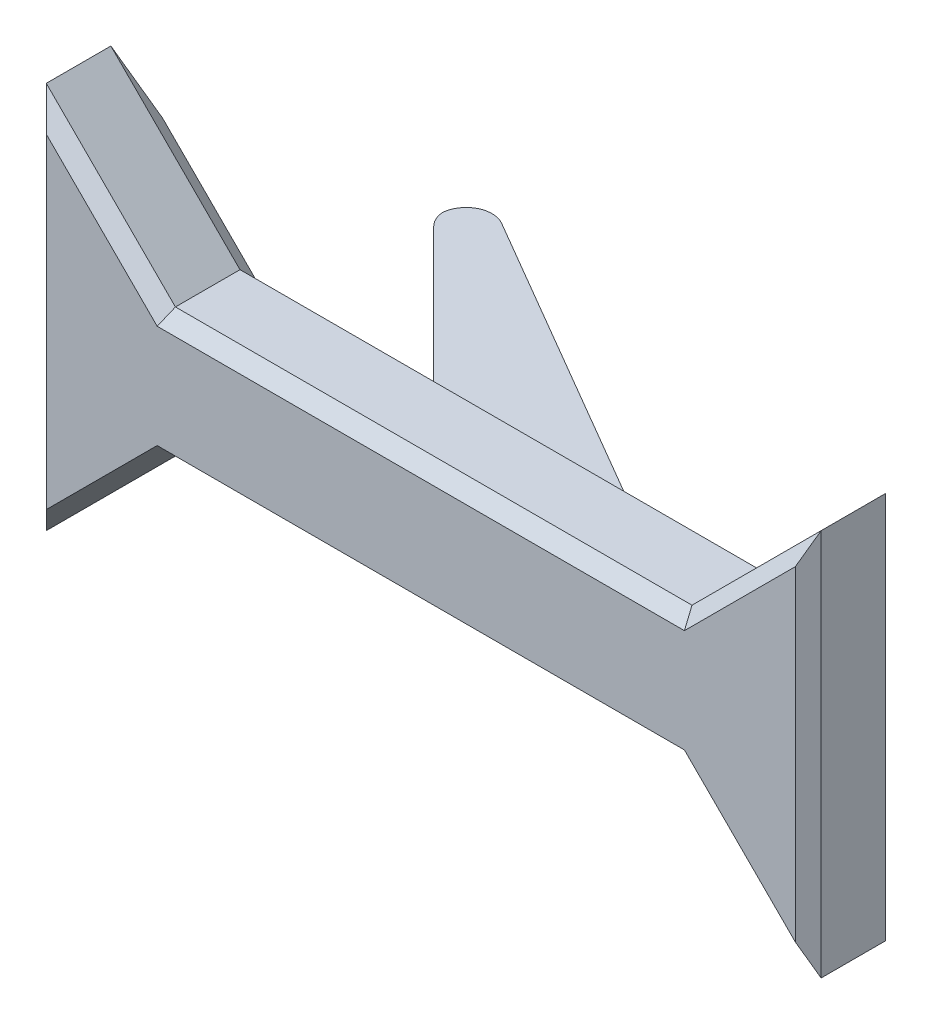
ISO-10303-21;
HEADER;
FILE_DESCRIPTION(('STEP AP214'),'2;1');
FILE_NAME('part.step','',(''),(''),'','','');
FILE_SCHEMA(('AUTOMOTIVE_DESIGN { 1 0 10303 214 1 1 1 1 }'));
ENDSEC;
DATA;
#1=APPLICATION_CONTEXT('core data for automotive mechanical design processes');
#2=APPLICATION_PROTOCOL_DEFINITION('international standard','automotive_design',2000,#1);
#3=PRODUCT_CONTEXT('',#1,'mechanical');
#4=PRODUCT('Part','Part','',(#3));
#5=PRODUCT_RELATED_PRODUCT_CATEGORY('part','',(#4));
#6=PRODUCT_DEFINITION_FORMATION('','',#4);
#7=PRODUCT_DEFINITION_CONTEXT('part definition',#1,'design');
#8=PRODUCT_DEFINITION('design','',#6,#7);
#9=PRODUCT_DEFINITION_SHAPE('','',#8);
#10=(LENGTH_UNIT() NAMED_UNIT(*) SI_UNIT(.MILLI.,.METRE.));
#11=(NAMED_UNIT(*) PLANE_ANGLE_UNIT() SI_UNIT($,.RADIAN.));
#12=(NAMED_UNIT(*) SI_UNIT($,.STERADIAN.) SOLID_ANGLE_UNIT());
#13=UNCERTAINTY_MEASURE_WITH_UNIT(LENGTH_MEASURE(1.E-05),#10,'distance_accuracy_value','');
#14=(GEOMETRIC_REPRESENTATION_CONTEXT(3) GLOBAL_UNCERTAINTY_ASSIGNED_CONTEXT((#13)) GLOBAL_UNIT_ASSIGNED_CONTEXT((#10,
#11,#12)) REPRESENTATION_CONTEXT('',''));
#15=CARTESIAN_POINT('',(0.,0.,0.));
#16=DIRECTION('',(0.,0.,1.));
#17=DIRECTION('',(1.,0.,0.));
#18=AXIS2_PLACEMENT_3D('',#15,#16,#17);
#19=CARTESIAN_POINT('',(0.,0.,0.));
#20=DIRECTION('',(0.,0.,1.));
#21=DIRECTION('',(1.,0.,0.));
#22=AXIS2_PLACEMENT_3D('',#19,#20,#21);
#23=PLANE('',#22);
#24=DIRECTION('',(0.,-1.,0.));
#25=VECTOR('',#24,1.);
#26=CARTESIAN_POINT('',(3.5,2.,0.));
#27=LINE('',#26,#25);
#28=CARTESIAN_POINT('',(3.5,1.5,0.));
#29=VERTEX_POINT('',#28);
#30=CARTESIAN_POINT('',(3.5,-1.5,0.));
#31=VERTEX_POINT('',#30);
#32=EDGE_CURVE('E372',#29,#31,#27,.T.);
#33=ORIENTED_EDGE('',*,*,#32,.F.);
#34=DIRECTION('',(1.,0.,0.));
#35=VECTOR('',#34,1.);
#36=CARTESIAN_POINT('',(10.,1.5,0.));
#37=LINE('',#36,#35);
#38=CARTESIAN_POINT('',(10.4142135623731,1.5,0.));
#39=VERTEX_POINT('',#38);
#40=EDGE_CURVE('E286',#29,#39,#37,.T.);
#41=ORIENTED_EDGE('',*,*,#40,.T.);
#42=DIRECTION('',(0.707106781186558,0.707106781186537,0.));
#43=VECTOR('',#42,1.);
#44=CARTESIAN_POINT('',(15.7071067811865,6.79289321881329,0.));
#45=LINE('',#44,#43);
#46=CARTESIAN_POINT('',(14.,5.0857864376268,0.));
#47=VERTEX_POINT('',#46);
#48=EDGE_CURVE('E284',#39,#47,#45,.T.);
#49=ORIENTED_EDGE('',*,*,#48,.T.);
#50=DIRECTION('',(0.,-1.,0.));
#51=VECTOR('',#50,1.);
#52=CARTESIAN_POINT('',(14.,-7.49999999999989,0.));
#53=LINE('',#52,#51);
#54=CARTESIAN_POINT('',(14.,-5.08578643762683,0.));
#55=VERTEX_POINT('',#54);
#56=EDGE_CURVE('E282',#47,#55,#53,.T.);
#57=ORIENTED_EDGE('',*,*,#56,.T.);
#58=DIRECTION('',(-0.707106781186554,0.707106781186541,0.));
#59=VECTOR('',#58,1.);
#60=CARTESIAN_POINT('',(10.7071067811865,-1.79289321881345,0.));
#61=LINE('',#60,#59);
#62=CARTESIAN_POINT('',(10.4142135623731,-1.5,0.));
#63=VERTEX_POINT('',#62);
#64=EDGE_CURVE('E279',#55,#63,#61,.T.);
#65=ORIENTED_EDGE('',*,*,#64,.T.);
#66=DIRECTION('',(-1.,0.,0.));
#67=VECTOR('',#66,1.);
#68=CARTESIAN_POINT('',(0.,-1.5,0.));
#69=LINE('',#68,#67);
#70=EDGE_CURVE('E277',#63,#31,#69,.T.);
#71=ORIENTED_EDGE('',*,*,#70,.T.);
#72=EDGE_LOOP('',(#33,#41,#49,#57,#65,#71));
#73=FACE_BOUND('',#72,.T.);
#74=ADVANCED_FACE('F43',(#73),#23,.F.);
#75=DIRECTION('',(1.,0.,0.));
#76=VECTOR('',#75,1.);
#77=CARTESIAN_POINT('',(10.,1.5,0.));
#78=LINE('',#77,#76);
#79=CARTESIAN_POINT('',(-10.4142135623731,1.5,0.));
#80=VERTEX_POINT('',#79);
#81=CARTESIAN_POINT('',(-4.20710678118654,1.5,0.));
#82=VERTEX_POINT('',#81);
#83=EDGE_CURVE('E274',#80,#82,#78,.T.);
#84=ORIENTED_EDGE('',*,*,#83,.T.);
#85=DIRECTION('',(0.,-1.,0.));
#86=VECTOR('',#85,1.);
#87=CARTESIAN_POINT('',(-4.20710678118655,-1.5,0.));
#88=LINE('',#87,#86);
#89=CARTESIAN_POINT('',(-4.20710678118655,-1.5,0.));
#90=VERTEX_POINT('',#89);
#91=EDGE_CURVE('E321',#82,#90,#88,.T.);
#92=ORIENTED_EDGE('',*,*,#91,.T.);
#93=DIRECTION('',(-1.,0.,0.));
#94=VECTOR('',#93,1.);
#95=CARTESIAN_POINT('',(0.,-1.5,0.));
#96=LINE('',#95,#94);
#97=CARTESIAN_POINT('',(-10.4142135623731,-1.5,0.));
#98=VERTEX_POINT('',#97);
#99=EDGE_CURVE('E272',#90,#98,#96,.T.);
#100=ORIENTED_EDGE('',*,*,#99,.T.);
#101=DIRECTION('',(-0.707106781186556,-0.707106781186539,0.));
#102=VECTOR('',#101,1.);
#103=CARTESIAN_POINT('',(-4.45710678118642,4.45710678118653,0.));
#104=LINE('',#103,#102);
#105=CARTESIAN_POINT('',(-14.,-5.08578643762681,0.));
#106=VERTEX_POINT('',#105);
#107=EDGE_CURVE('E270',#98,#106,#104,.T.);
#108=ORIENTED_EDGE('',*,*,#107,.T.);
#109=DIRECTION('',(0.,1.,0.));
#110=VECTOR('',#109,1.);
#111=CARTESIAN_POINT('',(-14.,0.,0.));
#112=LINE('',#111,#110);
#113=CARTESIAN_POINT('',(-14.,5.08578643762681,0.));
#114=VERTEX_POINT('',#113);
#115=EDGE_CURVE('E247',#106,#114,#112,.T.);
#116=ORIENTED_EDGE('',*,*,#115,.T.);
#117=DIRECTION('',(0.707106781186556,-0.707106781186539,0.));
#118=VECTOR('',#117,1.);
#119=CARTESIAN_POINT('',(-4.45710678118642,-4.45710678118653,0.));
#120=LINE('',#119,#118);
#121=EDGE_CURVE('E268',#114,#80,#120,.T.);
#122=ORIENTED_EDGE('',*,*,#121,.T.);
#123=EDGE_LOOP('',(#84,#92,#100,#108,#116,#122));
#124=FACE_BOUND('',#123,.T.);
#125=ADVANCED_FACE('F467',(#124),#23,.F.);
#126=CARTESIAN_POINT('',(-15.,0.,4.));
#127=DIRECTION('',(1.,0.,0.));
#128=DIRECTION('',(0.,0.,-1.));
#129=AXIS2_PLACEMENT_3D('',#126,#127,#128);
#130=PLANE('',#129);
#131=DIRECTION('',(0.,0.,-1.));
#132=VECTOR('',#131,1.);
#133=CARTESIAN_POINT('',(-15.,7.49999999999987,4.));
#134=LINE('',#133,#132);
#135=CARTESIAN_POINT('',(-15.,7.49999999999987,3.5));
#136=VERTEX_POINT('',#135);
#137=CARTESIAN_POINT('',(-15.,7.49999999999987,0.999999999999997));
#138=VERTEX_POINT('',#137);
#139=EDGE_CURVE('E376',#136,#138,#134,.T.);
#140=ORIENTED_EDGE('',*,*,#139,.T.);
#141=DIRECTION('',(0.,-1.,0.));
#142=VECTOR('',#141,1.);
#143=CARTESIAN_POINT('',(-15.,0.,0.999999999999997));
#144=LINE('',#143,#142);
#145=CARTESIAN_POINT('',(-15.,-7.49999999999987,0.999999999999997));
#146=VERTEX_POINT('',#145);
#147=EDGE_CURVE('E303',#138,#146,#144,.T.);
#148=ORIENTED_EDGE('',*,*,#147,.T.);
#149=DIRECTION('',(0.,0.,-1.));
#150=VECTOR('',#149,1.);
#151=CARTESIAN_POINT('',(-15.,-7.49999999999987,4.));
#152=LINE('',#151,#150);
#153=CARTESIAN_POINT('',(-15.,-7.49999999999987,3.5));
#154=VERTEX_POINT('',#153);
#155=EDGE_CURVE('E222',#154,#146,#152,.T.);
#156=ORIENTED_EDGE('',*,*,#155,.F.);
#157=DIRECTION('',(0.,1.,0.));
#158=VECTOR('',#157,1.);
#159=CARTESIAN_POINT('',(-15.,7.49999999999987,3.5));
#160=LINE('',#159,#158);
#161=EDGE_CURVE('E246',#154,#136,#160,.T.);
#162=ORIENTED_EDGE('',*,*,#161,.T.);
#163=EDGE_LOOP('',(#140,#148,#156,#162));
#164=FACE_BOUND('',#163,.T.);
#165=ADVANCED_FACE('F486',(#164),#130,.F.);
#166=CARTESIAN_POINT('',(-3.74999999999988,3.74999999999997,4.));
#167=DIRECTION('',(-0.707106781186539,0.707106781186556,0.));
#168=DIRECTION('',(-0.707106781186556,-0.707106781186539,0.));
#169=AXIS2_PLACEMENT_3D('',#166,#167,#168);
#170=PLANE('',#169);
#171=ORIENTED_EDGE('',*,*,#155,.T.);
#172=DIRECTION('',(0.707106781186556,0.707106781186539,0.));
#173=VECTOR('',#172,1.);
#174=CARTESIAN_POINT('',(-3.74999999999988,3.74999999999997,0.999999999999998));
#175=LINE('',#174,#173);
#176=CARTESIAN_POINT('',(-10.,-2.5,0.999999999999998));
#177=VERTEX_POINT('',#176);
#178=EDGE_CURVE('E299',#146,#177,#175,.T.);
#179=ORIENTED_EDGE('',*,*,#178,.T.);
#180=DIRECTION('',(0.,0.,-1.));
#181=VECTOR('',#180,1.);
#182=CARTESIAN_POINT('',(-10.,-2.5,4.));
#183=LINE('',#182,#181);
#184=CARTESIAN_POINT('',(-10.,-2.5,3.5));
#185=VERTEX_POINT('',#184);
#186=EDGE_CURVE('E399',#185,#177,#183,.T.);
#187=ORIENTED_EDGE('',*,*,#186,.F.);
#188=DIRECTION('',(-0.707106781186556,-0.707106781186539,0.));
#189=VECTOR('',#188,1.);
#190=CARTESIAN_POINT('',(-15.,-7.49999999999987,3.5));
#191=LINE('',#190,#189);
#192=EDGE_CURVE('E244',#185,#154,#191,.T.);
#193=ORIENTED_EDGE('',*,*,#192,.T.);
#194=EDGE_LOOP('',(#171,#179,#187,#193));
#195=FACE_BOUND('',#194,.T.);
#196=ADVANCED_FACE('F521',(#195),#170,.F.);
#197=CARTESIAN_POINT('',(0.,-2.5,4.));
#198=DIRECTION('',(0.,1.,0.));
#199=DIRECTION('',(0.,0.,1.));
#200=AXIS2_PLACEMENT_3D('',#197,#198,#199);
#201=PLANE('',#200);
#202=ORIENTED_EDGE('',*,*,#186,.T.);
#203=DIRECTION('',(1.,0.,0.));
#204=VECTOR('',#203,1.);
#205=CARTESIAN_POINT('',(0.,-2.5,0.999999999999997));
#206=LINE('',#205,#204);
#207=CARTESIAN_POINT('',(10.,-2.5,0.999999999999997));
#208=VERTEX_POINT('',#207);
#209=EDGE_CURVE('E297',#177,#208,#206,.T.);
#210=ORIENTED_EDGE('',*,*,#209,.T.);
#211=DIRECTION('',(0.,0.,-1.));
#212=VECTOR('',#211,1.);
#213=CARTESIAN_POINT('',(10.,-2.5,4.));
#214=LINE('',#213,#212);
#215=CARTESIAN_POINT('',(10.,-2.5,3.5));
#216=VERTEX_POINT('',#215);
#217=EDGE_CURVE('E396',#216,#208,#214,.T.);
#218=ORIENTED_EDGE('',*,*,#217,.F.);
#219=DIRECTION('',(-1.,0.,0.));
#220=VECTOR('',#219,1.);
#221=CARTESIAN_POINT('',(-10.,-2.5,3.5));
#222=LINE('',#221,#220);
#223=EDGE_CURVE('E242',#216,#185,#222,.T.);
#224=ORIENTED_EDGE('',*,*,#223,.T.);
#225=EDGE_LOOP('',(#202,#210,#218,#224));
#226=FACE_BOUND('',#225,.T.);
#227=ADVANCED_FACE('F519',(#226),#201,.F.);
#228=CARTESIAN_POINT('',(3.74999999999991,3.74999999999998,4.));
#229=DIRECTION('',(-0.707106781186541,-0.707106781186554,0.));
#230=DIRECTION('',(0.707106781186554,-0.707106781186541,0.));
#231=AXIS2_PLACEMENT_3D('',#228,#229,#230);
#232=PLANE('',#231);
#233=ORIENTED_EDGE('',*,*,#217,.T.);
#234=DIRECTION('',(0.707106781186554,-0.707106781186541,0.));
#235=VECTOR('',#234,1.);
#236=CARTESIAN_POINT('',(15.,-7.4999999999999,0.999999999999999));
#237=LINE('',#236,#235);
#238=CARTESIAN_POINT('',(15.,-7.4999999999999,0.999999999999997));
#239=VERTEX_POINT('',#238);
#240=EDGE_CURVE('E288',#208,#239,#237,.T.);
#241=ORIENTED_EDGE('',*,*,#240,.T.);
#242=DIRECTION('',(0.,0.,-1.));
#243=VECTOR('',#242,1.);
#244=CARTESIAN_POINT('',(15.,-7.4999999999999,4.));
#245=LINE('',#244,#243);
#246=CARTESIAN_POINT('',(15.,-7.4999999999999,3.5));
#247=VERTEX_POINT('',#246);
#248=EDGE_CURVE('E393',#247,#239,#245,.T.);
#249=ORIENTED_EDGE('',*,*,#248,.F.);
#250=DIRECTION('',(-0.707106781186554,0.707106781186541,0.));
#251=VECTOR('',#250,1.);
#252=CARTESIAN_POINT('',(3.74999999999991,3.74999999999998,3.5));
#253=LINE('',#252,#251);
#254=EDGE_CURVE('E240',#247,#216,#253,.T.);
#255=ORIENTED_EDGE('',*,*,#254,.T.);
#256=EDGE_LOOP('',(#233,#241,#249,#255));
#257=FACE_BOUND('',#256,.T.);
#258=ADVANCED_FACE('F511',(#257),#232,.T.);
#259=CARTESIAN_POINT('',(15.,0.,4.));
#260=DIRECTION('',(1.,0.,0.));
#261=DIRECTION('',(0.,1.,0.));
#262=AXIS2_PLACEMENT_3D('',#259,#260,#261);
#263=PLANE('',#262);
#264=ORIENTED_EDGE('',*,*,#248,.T.);
#265=DIRECTION('',(0.,1.,0.));
#266=VECTOR('',#265,1.);
#267=CARTESIAN_POINT('',(15.,7.49999999999985,0.999999999999997));
#268=LINE('',#267,#266);
#269=CARTESIAN_POINT('',(15.,7.49999999999985,0.999999999999998));
#270=VERTEX_POINT('',#269);
#271=EDGE_CURVE('E291',#239,#270,#268,.T.);
#272=ORIENTED_EDGE('',*,*,#271,.T.);
#273=DIRECTION('',(0.,0.,-1.));
#274=VECTOR('',#273,1.);
#275=CARTESIAN_POINT('',(15.,7.49999999999985,4.));
#276=LINE('',#275,#274);
#277=CARTESIAN_POINT('',(15.,7.49999999999985,3.5));
#278=VERTEX_POINT('',#277);
#279=EDGE_CURVE('E390',#278,#270,#276,.T.);
#280=ORIENTED_EDGE('',*,*,#279,.F.);
#281=DIRECTION('',(0.,-1.,0.));
#282=VECTOR('',#281,1.);
#283=CARTESIAN_POINT('',(15.,0.,3.5));
#284=LINE('',#283,#282);
#285=EDGE_CURVE('E238',#278,#247,#284,.T.);
#286=ORIENTED_EDGE('',*,*,#285,.T.);
#287=EDGE_LOOP('',(#264,#272,#280,#286));
#288=FACE_BOUND('',#287,.T.);
#289=ADVANCED_FACE('F509',(#288),#263,.T.);
#290=CARTESIAN_POINT('',(3.74999999999985,-3.74999999999996,4.));
#291=DIRECTION('',(-0.707106781186537,0.707106781186558,0.));
#292=DIRECTION('',(-0.707106781186558,-0.707106781186537,0.));
#293=AXIS2_PLACEMENT_3D('',#290,#291,#292);
#294=PLANE('',#293);
#295=ORIENTED_EDGE('',*,*,#279,.T.);
#296=DIRECTION('',(-0.707106781186558,-0.707106781186537,0.));
#297=VECTOR('',#296,1.);
#298=CARTESIAN_POINT('',(10.,2.5,0.999999999999999));
#299=LINE('',#298,#297);
#300=CARTESIAN_POINT('',(10.,2.5,0.999999999999997));
#301=VERTEX_POINT('',#300);
#302=EDGE_CURVE('E293',#270,#301,#299,.T.);
#303=ORIENTED_EDGE('',*,*,#302,.T.);
#304=DIRECTION('',(0.,0.,-1.));
#305=VECTOR('',#304,1.);
#306=CARTESIAN_POINT('',(10.,2.5,4.));
#307=LINE('',#306,#305);
#308=CARTESIAN_POINT('',(10.,2.5,3.5));
#309=VERTEX_POINT('',#308);
#310=EDGE_CURVE('E387',#309,#301,#307,.T.);
#311=ORIENTED_EDGE('',*,*,#310,.F.);
#312=DIRECTION('',(0.707106781186558,0.707106781186537,0.));
#313=VECTOR('',#312,1.);
#314=CARTESIAN_POINT('',(3.74999999999985,-3.74999999999996,3.5));
#315=LINE('',#314,#313);
#316=EDGE_CURVE('E236',#309,#278,#315,.T.);
#317=ORIENTED_EDGE('',*,*,#316,.T.);
#318=EDGE_LOOP('',(#295,#303,#311,#317));
#319=FACE_BOUND('',#318,.T.);
#320=ADVANCED_FACE('F543',(#319),#294,.T.);
#321=CARTESIAN_POINT('',(0.,2.5,4.));
#322=DIRECTION('',(0.,1.,0.));
#323=DIRECTION('',(0.,0.,1.));
#324=AXIS2_PLACEMENT_3D('',#321,#322,#323);
#325=PLANE('',#324);
#326=ORIENTED_EDGE('',*,*,#310,.T.);
#327=DIRECTION('',(-1.,0.,0.));
#328=VECTOR('',#327,1.);
#329=CARTESIAN_POINT('',(-10.,2.5,0.999999999999997));
#330=LINE('',#329,#328);
#331=CARTESIAN_POINT('',(-10.,2.5,0.999999999999998));
#332=VERTEX_POINT('',#331);
#333=EDGE_CURVE('E295',#301,#332,#330,.T.);
#334=ORIENTED_EDGE('',*,*,#333,.T.);
#335=DIRECTION('',(0.,0.,-1.));
#336=VECTOR('',#335,1.);
#337=CARTESIAN_POINT('',(-10.,2.5,4.));
#338=LINE('',#337,#336);
#339=CARTESIAN_POINT('',(-10.,2.5,3.5));
#340=VERTEX_POINT('',#339);
#341=EDGE_CURVE('E384',#340,#332,#338,.T.);
#342=ORIENTED_EDGE('',*,*,#341,.F.);
#343=DIRECTION('',(1.,0.,0.));
#344=VECTOR('',#343,1.);
#345=CARTESIAN_POINT('',(0.,2.5,3.5));
#346=LINE('',#345,#344);
#347=EDGE_CURVE('E229',#340,#309,#346,.T.);
#348=ORIENTED_EDGE('',*,*,#347,.T.);
#349=EDGE_LOOP('',(#326,#334,#342,#348));
#350=FACE_BOUND('',#349,.T.);
#351=ADVANCED_FACE('F427',(#350),#325,.T.);
#352=CARTESIAN_POINT('',(-3.74999999999988,-3.74999999999997,4.));
#353=DIRECTION('',(-0.707106781186539,-0.707106781186556,0.));
#354=DIRECTION('',(0.707106781186556,-0.707106781186539,0.));
#355=AXIS2_PLACEMENT_3D('',#352,#353,#354);
#356=PLANE('',#355);
#357=ORIENTED_EDGE('',*,*,#341,.T.);
#358=DIRECTION('',(-0.707106781186556,0.707106781186539,0.));
#359=VECTOR('',#358,1.);
#360=CARTESIAN_POINT('',(-3.74999999999988,-3.74999999999997,0.999999999999998));
#361=LINE('',#360,#359);
#362=EDGE_CURVE('E301',#332,#138,#361,.T.);
#363=ORIENTED_EDGE('',*,*,#362,.T.);
#364=ORIENTED_EDGE('',*,*,#139,.F.);
#365=DIRECTION('',(0.707106781186556,-0.707106781186539,0.));
#366=VECTOR('',#365,1.);
#367=CARTESIAN_POINT('',(-10.,2.5,3.5));
#368=LINE('',#367,#366);
#369=EDGE_CURVE('E208',#136,#340,#368,.T.);
#370=ORIENTED_EDGE('',*,*,#369,.T.);
#371=EDGE_LOOP('',(#357,#363,#364,#370));
#372=FACE_BOUND('',#371,.T.);
#373=ADVANCED_FACE('F425',(#372),#356,.F.);
#374=CARTESIAN_POINT('',(0.,0.,4.));
#375=DIRECTION('',(0.,0.,1.));
#376=DIRECTION('',(1.,0.,0.));
#377=AXIS2_PLACEMENT_3D('',#374,#375,#376);
#378=PLANE('',#377);
#379=DIRECTION('',(-1.,0.,0.));
#380=VECTOR('',#379,1.);
#381=CARTESIAN_POINT('',(0.,2.,4.));
#382=LINE('',#381,#380);
#383=CARTESIAN_POINT('',(10.2071067811865,2.,4.));
#384=VERTEX_POINT('',#383);
#385=CARTESIAN_POINT('',(-10.2071067811865,2.,4.));
#386=VERTEX_POINT('',#385);
#387=EDGE_CURVE('E226',#384,#386,#382,.T.);
#388=ORIENTED_EDGE('',*,*,#387,.T.);
#389=DIRECTION('',(-0.707106781186556,0.707106781186539,0.));
#390=VECTOR('',#389,1.);
#391=CARTESIAN_POINT('',(-15.3535533905933,7.1464466094066,4.));
#392=LINE('',#391,#390);
#393=CARTESIAN_POINT('',(-14.5,6.29289321881336,4.));
#394=VERTEX_POINT('',#393);
#395=EDGE_CURVE('E206',#386,#394,#392,.T.);
#396=ORIENTED_EDGE('',*,*,#395,.T.);
#397=DIRECTION('',(0.,-1.,0.));
#398=VECTOR('',#397,1.);
#399=CARTESIAN_POINT('',(-14.5,-7.49999999999987,4.));
#400=LINE('',#399,#398);
#401=CARTESIAN_POINT('',(-14.5,-6.29289321881335,4.));
#402=VERTEX_POINT('',#401);
#403=EDGE_CURVE('E215',#394,#402,#400,.T.);
#404=ORIENTED_EDGE('',*,*,#403,.T.);
#405=DIRECTION('',(0.707106781186556,0.707106781186539,0.));
#406=VECTOR('',#405,1.);
#407=CARTESIAN_POINT('',(-10.3535533905933,-2.14644660940672,4.));
#408=LINE('',#407,#406);
#409=CARTESIAN_POINT('',(-10.2071067811865,-2.,4.));
#410=VERTEX_POINT('',#409);
#411=EDGE_CURVE('E221',#402,#410,#408,.T.);
#412=ORIENTED_EDGE('',*,*,#411,.T.);
#413=DIRECTION('',(1.,0.,0.));
#414=VECTOR('',#413,1.);
#415=CARTESIAN_POINT('',(10.,-2.,4.));
#416=LINE('',#415,#414);
#417=CARTESIAN_POINT('',(10.2071067811865,-2.,4.));
#418=VERTEX_POINT('',#417);
#419=EDGE_CURVE('E405',#410,#418,#416,.T.);
#420=ORIENTED_EDGE('',*,*,#419,.T.);
#421=DIRECTION('',(0.707106781186554,-0.707106781186541,0.));
#422=VECTOR('',#421,1.);
#423=CARTESIAN_POINT('',(4.10355339059318,4.10355339059325,4.));
#424=LINE('',#423,#422);
#425=CARTESIAN_POINT('',(14.5,-6.29289321881337,4.));
#426=VERTEX_POINT('',#425);
#427=EDGE_CURVE('E407',#418,#426,#424,.T.);
#428=ORIENTED_EDGE('',*,*,#427,.T.);
#429=DIRECTION('',(0.,1.,0.));
#430=VECTOR('',#429,1.);
#431=CARTESIAN_POINT('',(14.5,0.,4.));
#432=LINE('',#431,#430);
#433=CARTESIAN_POINT('',(14.5,6.29289321881334,4.));
#434=VERTEX_POINT('',#433);
#435=EDGE_CURVE('E409',#426,#434,#432,.T.);
#436=ORIENTED_EDGE('',*,*,#435,.T.);
#437=DIRECTION('',(-0.707106781186558,-0.707106781186537,0.));
#438=VECTOR('',#437,1.);
#439=CARTESIAN_POINT('',(4.10355339059311,-4.10355339059324,4.));
#440=LINE('',#439,#438);
#441=EDGE_CURVE('E231',#434,#384,#440,.T.);
#442=ORIENTED_EDGE('',*,*,#441,.T.);
#443=EDGE_LOOP('',(#388,#396,#404,#412,#420,#428,#436,#442));
#444=FACE_BOUND('',#443,.T.);
#445=ADVANCED_FACE('F224',(#444),#378,.T.);
#446=CARTESIAN_POINT('',(3.5,2.,0.));
#447=DIRECTION('',(-0.503871025524087,0.,0.863778900898433));
#448=DIRECTION('',(0.863778900898433,0.,0.503871025524087));
#449=AXIS2_PLACEMENT_3D('',#446,#447,#448);
#450=PLANE('',#449);
#451=DIRECTION('',(-0.863778900898433,0.,-0.503871025524087));
#452=VECTOR('',#451,1.);
#453=CARTESIAN_POINT('',(3.5,-2.,0.));
#454=LINE('',#453,#452);
#455=CARTESIAN_POINT('',(4.35714285714286,-2.,0.5));
#456=VERTEX_POINT('',#455);
#457=CARTESIAN_POINT('',(-6.99612897447589,-2.,-6.12274190177761));
#458=VERTEX_POINT('',#457);
#459=EDGE_CURVE('E366',#456,#458,#454,.T.);
#460=ORIENTED_EDGE('',*,*,#459,.T.);
#461=DIRECTION('',(0.,-1.,0.));
#462=VECTOR('',#461,1.);
#463=CARTESIAN_POINT('',(-6.9961289744759,2.,-6.12274190177762));
#464=LINE('',#463,#462);
#465=CARTESIAN_POINT('',(-6.99612897447589,2.,-6.12274190177761));
#466=VERTEX_POINT('',#465);
#467=EDGE_CURVE('E357',#458,#466,#464,.F.);
#468=ORIENTED_EDGE('',*,*,#467,.T.);
#469=DIRECTION('',(-0.863778900898433,0.,-0.503871025524087));
#470=VECTOR('',#469,1.);
#471=CARTESIAN_POINT('',(3.5,2.,0.));
#472=LINE('',#471,#470);
#473=CARTESIAN_POINT('',(4.35714285714286,2.,0.500000000000001));
#474=VERTEX_POINT('',#473);
#475=EDGE_CURVE('E365',#474,#466,#472,.T.);
#476=ORIENTED_EDGE('',*,*,#475,.F.);
#477=DIRECTION('',(-0.771389215839869,-0.44997704257326,-0.449977042573257));
#478=VECTOR('',#477,1.);
#479=CARTESIAN_POINT('',(3.67355371900827,1.60123966942148,0.101239669421488));
#480=LINE('',#479,#478);
#481=EDGE_CURVE('E311',#474,#29,#480,.T.);
#482=ORIENTED_EDGE('',*,*,#481,.T.);
#483=ORIENTED_EDGE('',*,*,#32,.T.);
#484=DIRECTION('',(-0.771389215839869,0.44997704257326,-0.449977042573257));
#485=VECTOR('',#484,1.);
#486=CARTESIAN_POINT('',(2.28512396694215,-0.791322314049574,-0.708677685950417));
#487=LINE('',#486,#485);
#488=EDGE_CURVE('E313',#31,#456,#487,.F.);
#489=ORIENTED_EDGE('',*,*,#488,.T.);
#490=EDGE_LOOP('',(#460,#468,#476,#482,#483,#489));
#491=FACE_BOUND('',#490,.T.);
#492=ADVANCED_FACE('F364',(#491),#450,.F.);
#493=CARTESIAN_POINT('',(-8.49999999999998,2.,-5.));
#494=DIRECTION('',(0.707106781186549,0.,-0.707106781186546));
#495=DIRECTION('',(-0.707106781186546,0.,-0.707106781186549));
#496=AXIS2_PLACEMENT_3D('',#493,#494,#495);
#497=PLANE('',#496);
#498=DIRECTION('',(0.707106781186546,0.,0.707106781186549));
#499=VECTOR('',#498,1.);
#500=CARTESIAN_POINT('',(-8.49999999999998,2.,-5.));
#501=LINE('',#500,#499);
#502=CARTESIAN_POINT('',(-8.20710678118653,2.,-4.70710678118655));
#503=VERTEX_POINT('',#502);
#504=CARTESIAN_POINT('',(-3.,2.,0.500000000000001));
#505=VERTEX_POINT('',#504);
#506=EDGE_CURVE('E373',#503,#505,#501,.T.);
#507=ORIENTED_EDGE('',*,*,#506,.F.);
#508=DIRECTION('',(0.,-1.,0.));
#509=VECTOR('',#508,1.);
#510=CARTESIAN_POINT('',(-8.20710678118653,2.,-4.70710678118655));
#511=LINE('',#510,#509);
#512=CARTESIAN_POINT('',(-8.20710678118653,-2.,-4.70710678118655));
#513=VERTEX_POINT('',#512);
#514=EDGE_CURVE('E11',#503,#513,#511,.T.);
#515=ORIENTED_EDGE('',*,*,#514,.T.);
#516=DIRECTION('',(0.707106781186546,0.,0.707106781186549));
#517=VECTOR('',#516,1.);
#518=CARTESIAN_POINT('',(-8.49999999999998,-2.,-5.));
#519=LINE('',#518,#517);
#520=CARTESIAN_POINT('',(-3.,-2.,0.5));
#521=VERTEX_POINT('',#520);
#522=EDGE_CURVE('E266',#513,#521,#519,.T.);
#523=ORIENTED_EDGE('',*,*,#522,.T.);
#524=DIRECTION('',(0.577350269189623,-0.577350269189629,0.577350269189625));
#525=VECTOR('',#524,1.);
#526=CARTESIAN_POINT('',(-7.99999999999997,3.00000000000002,-4.49999999999998));
#527=LINE('',#526,#525);
#528=CARTESIAN_POINT('',(-4.20710678118655,-0.792893218813438,-0.707106781186553));
#529=VERTEX_POINT('',#528);
#530=EDGE_CURVE('E319',#521,#529,#527,.F.);
#531=ORIENTED_EDGE('',*,*,#530,.T.);
#532=DIRECTION('',(0.,1.,0.));
#533=VECTOR('',#532,1.);
#534=CARTESIAN_POINT('',(-4.20710678118655,1.5,-0.707106781186553));
#535=LINE('',#534,#533);
#536=CARTESIAN_POINT('',(-4.20710678118655,0.792893218813438,-0.707106781186552));
#537=VERTEX_POINT('',#536);
#538=EDGE_CURVE('E345',#529,#537,#535,.T.);
#539=ORIENTED_EDGE('',*,*,#538,.T.);
#540=DIRECTION('',(0.577350269189623,0.577350269189629,0.577350269189625));
#541=VECTOR('',#540,1.);
#542=CARTESIAN_POINT('',(-6.66666666666663,-1.66666666666667,-3.16666666666665));
#543=LINE('',#542,#541);
#544=EDGE_CURVE('E305',#537,#505,#543,.T.);
#545=ORIENTED_EDGE('',*,*,#544,.T.);
#546=EDGE_LOOP('',(#507,#515,#523,#531,#539,#545));
#547=FACE_BOUND('',#546,.T.);
#548=ADVANCED_FACE('F461',(#547),#497,.F.);
#549=CARTESIAN_POINT('',(0.,2.,0.));
#550=DIRECTION('',(0.,1.,0.));
#551=DIRECTION('',(0.,0.,1.));
#552=AXIS2_PLACEMENT_3D('',#549,#550,#551);
#553=PLANE('',#552);
#554=ORIENTED_EDGE('',*,*,#475,.T.);
#555=CARTESIAN_POINT('',(-7.49999999999998,2.,-5.25896300087918));
#556=DIRECTION('',(0.,1.,0.));
#557=DIRECTION('',(0.,0.,1.));
#558=AXIS2_PLACEMENT_3D('',#555,#556,#557);
#559=CIRCLE('',#558,1.);
#560=CARTESIAN_POINT('',(-8.49698260555986,2.,-5.33658828162614));
#561=VERTEX_POINT('',#560);
#562=EDGE_CURVE('E52',#466,#561,#559,.T.);
#563=ORIENTED_EDGE('',*,*,#562,.T.);
#564=CARTESIAN_POINT('',(-7.49999999999998,2.,-5.41421356237309));
#565=DIRECTION('',(0.,1.,0.));
#566=DIRECTION('',(0.,0.,1.));
#567=AXIS2_PLACEMENT_3D('',#564,#565,#566);
#568=CIRCLE('',#567,1.);
#569=EDGE_CURVE('E62',#561,#503,#568,.T.);
#570=ORIENTED_EDGE('',*,*,#569,.T.);
#571=ORIENTED_EDGE('',*,*,#506,.T.);
#572=DIRECTION('',(1.,0.,0.));
#573=VECTOR('',#572,1.);
#574=CARTESIAN_POINT('',(0.,2.,0.500000000000001));
#575=LINE('',#574,#573);
#576=EDGE_CURVE('E308',#505,#474,#575,.T.);
#577=ORIENTED_EDGE('',*,*,#576,.T.);
#578=EDGE_LOOP('',(#554,#563,#570,#571,#577));
#579=FACE_BOUND('',#578,.T.);
#580=ADVANCED_FACE('F369',(#579),#553,.T.);
#581=CARTESIAN_POINT('',(0.,-2.,0.));
#582=DIRECTION('',(0.,1.,0.));
#583=DIRECTION('',(0.,0.,1.));
#584=AXIS2_PLACEMENT_3D('',#581,#582,#583);
#585=PLANE('',#584);
#586=CARTESIAN_POINT('',(-7.49999999999998,-2.,-5.41421356237309));
#587=DIRECTION('',(0.,1.,0.));
#588=DIRECTION('',(0.,0.,1.));
#589=AXIS2_PLACEMENT_3D('',#586,#587,#588);
#590=CIRCLE('',#589,1.);
#591=CARTESIAN_POINT('',(-8.49698260555986,-2.,-5.33658828162614));
#592=VERTEX_POINT('',#591);
#593=EDGE_CURVE('E353',#513,#592,#590,.F.);
#594=ORIENTED_EDGE('',*,*,#593,.T.);
#595=CARTESIAN_POINT('',(-7.49999999999998,-2.,-5.25896300087918));
#596=DIRECTION('',(0.,1.,0.));
#597=DIRECTION('',(0.,0.,1.));
#598=AXIS2_PLACEMENT_3D('',#595,#596,#597);
#599=CIRCLE('',#598,1.);
#600=EDGE_CURVE('E355',#592,#458,#599,.F.);
#601=ORIENTED_EDGE('',*,*,#600,.T.);
#602=ORIENTED_EDGE('',*,*,#459,.F.);
#603=DIRECTION('',(1.,0.,0.));
#604=VECTOR('',#603,1.);
#605=CARTESIAN_POINT('',(0.,-2.,0.5));
#606=LINE('',#605,#604);
#607=EDGE_CURVE('E316',#456,#521,#606,.F.);
#608=ORIENTED_EDGE('',*,*,#607,.T.);
#609=ORIENTED_EDGE('',*,*,#522,.F.);
#610=EDGE_LOOP('',(#594,#601,#602,#608,#609));
#611=FACE_BOUND('',#610,.T.);
#612=ADVANCED_FACE('F453',(#611),#585,.F.);
#613=CARTESIAN_POINT('',(3.74999999999991,3.74999999999998,3.5));
#614=DIRECTION('',(0.499999999999995,0.500000000000004,-0.707106781186548));
#615=DIRECTION('',(-0.707106781186554,0.707106781186541,0.));
#616=AXIS2_PLACEMENT_3D('',#613,#614,#615);
#617=PLANE('',#616);
#618=DIRECTION('',(-0.281084637714818,-0.678598344545848,-0.678598344545848));
#619=VECTOR('',#618,1.);
#620=CARTESIAN_POINT('',(10.6983437266954,-0.814049103813651,5.18595089618635));
#621=LINE('',#620,#619);
#622=EDGE_CURVE('E260',#216,#418,#621,.F.);
#623=ORIENTED_EDGE('',*,*,#622,.F.);
#624=ORIENTED_EDGE('',*,*,#254,.F.);
#625=DIRECTION('',(-0.357406744336596,0.862856209461014,0.357406744336597));
#626=VECTOR('',#625,1.);
#627=CARTESIAN_POINT('',(10.0935351425472,4.34525400216948,8.40646485745281));
#628=LINE('',#627,#626);
#629=EDGE_CURVE('E263',#426,#247,#628,.F.);
#630=ORIENTED_EDGE('',*,*,#629,.F.);
#631=ORIENTED_EDGE('',*,*,#427,.F.);
#632=EDGE_LOOP('',(#623,#624,#630,#631));
#633=FACE_BOUND('',#632,.T.);
#634=ADVANCED_FACE('F501',(#633),#617,.F.);
#635=CARTESIAN_POINT('',(15.,0.,3.5));
#636=DIRECTION('',(-0.707106781186547,0.,-0.707106781186547));
#637=DIRECTION('',(0.,-1.,0.));
#638=AXIS2_PLACEMENT_3D('',#635,#636,#637);
#639=PLANE('',#638);
#640=ORIENTED_EDGE('',*,*,#629,.T.);
#641=ORIENTED_EDGE('',*,*,#285,.F.);
#642=DIRECTION('',(-0.3574067443366,-0.862856209461012,0.357406744336599));
#643=VECTOR('',#642,1.);
#644=CARTESIAN_POINT('',(12.6870702850944,1.91609371345925,5.81292971490556));
#645=LINE('',#644,#643);
#646=EDGE_CURVE('E257',#434,#278,#645,.F.);
#647=ORIENTED_EDGE('',*,*,#646,.F.);
#648=ORIENTED_EDGE('',*,*,#435,.F.);
#649=EDGE_LOOP('',(#640,#641,#647,#648));
#650=FACE_BOUND('',#649,.T.);
#651=ADVANCED_FACE('F505',(#650),#639,.F.);
#652=CARTESIAN_POINT('',(0.,-2.,4.));
#653=DIRECTION('',(0.,-0.707106781186547,0.707106781186547));
#654=DIRECTION('',(-1.,0.,0.));
#655=AXIS2_PLACEMENT_3D('',#652,#653,#654);
#656=PLANE('',#655);
#657=ORIENTED_EDGE('',*,*,#622,.T.);
#658=ORIENTED_EDGE('',*,*,#419,.F.);
#659=DIRECTION('',(-0.281084637714815,0.678598344545848,0.678598344545848));
#660=VECTOR('',#659,1.);
#661=CARTESIAN_POINT('',(-9.40065783423785,-3.94693998508507,2.05306001491494));
#662=LINE('',#661,#660);
#663=EDGE_CURVE('E254',#185,#410,#662,.T.);
#664=ORIENTED_EDGE('',*,*,#663,.F.);
#665=ORIENTED_EDGE('',*,*,#223,.F.);
#666=EDGE_LOOP('',(#657,#658,#664,#665));
#667=FACE_BOUND('',#666,.T.);
#668=ADVANCED_FACE('F496',(#667),#656,.T.);
#669=CARTESIAN_POINT('',(3.74999999999985,-3.74999999999996,3.5));
#670=DIRECTION('',(0.499999999999993,-0.500000000000008,-0.707106781186546));
#671=DIRECTION('',(0.707106781186558,0.707106781186537,0.));
#672=AXIS2_PLACEMENT_3D('',#669,#670,#671);
#673=PLANE('',#672);
#674=ORIENTED_EDGE('',*,*,#646,.T.);
#675=ORIENTED_EDGE('',*,*,#316,.F.);
#676=DIRECTION('',(0.281084637714812,-0.678598344545849,0.678598344545849));
#677=VECTOR('',#676,1.);
#678=CARTESIAN_POINT('',(9.20991426440733,4.40743569830541,1.59256430169459));
#679=LINE('',#678,#677);
#680=EDGE_CURVE('E251',#384,#309,#679,.F.);
#681=ORIENTED_EDGE('',*,*,#680,.F.);
#682=ORIENTED_EDGE('',*,*,#441,.F.);
#683=EDGE_LOOP('',(#674,#675,#681,#682));
#684=FACE_BOUND('',#683,.T.);
#685=ADVANCED_FACE('F416',(#684),#673,.F.);
#686=CARTESIAN_POINT('',(-4.10355339059315,4.10355339059325,4.));
#687=DIRECTION('',(0.499999999999994,-0.500000000000006,0.707106781186547));
#688=DIRECTION('',(-0.707106781186556,-0.707106781186539,0.));
#689=AXIS2_PLACEMENT_3D('',#686,#687,#688);
#690=PLANE('',#689);
#691=ORIENTED_EDGE('',*,*,#663,.T.);
#692=ORIENTED_EDGE('',*,*,#411,.F.);
#693=DIRECTION('',(0.357406744336598,0.862856209461013,0.357406744336598));
#694=VECTOR('',#693,1.);
#695=CARTESIAN_POINT('',(-12.5593307041972,-1.60770308480519,5.94066929580284));
#696=LINE('',#695,#694);
#697=EDGE_CURVE('E218',#154,#402,#696,.T.);
#698=ORIENTED_EDGE('',*,*,#697,.F.);
#699=ORIENTED_EDGE('',*,*,#192,.F.);
#700=EDGE_LOOP('',(#691,#692,#698,#699));
#701=FACE_BOUND('',#700,.T.);
#702=ADVANCED_FACE('F491',(#701),#690,.T.);
#703=CARTESIAN_POINT('',(0.,2.5,3.5));
#704=DIRECTION('',(0.,-0.707106781186547,-0.707106781186547));
#705=DIRECTION('',(1.,0.,0.));
#706=AXIS2_PLACEMENT_3D('',#703,#704,#705);
#707=PLANE('',#706);
#708=ORIENTED_EDGE('',*,*,#680,.T.);
#709=ORIENTED_EDGE('',*,*,#347,.F.);
#710=DIRECTION('',(0.281084637714815,0.678598344545848,-0.678598344545848));
#711=VECTOR('',#710,1.);
#712=CARTESIAN_POINT('',(-10.889087296526,0.353553390593283,5.64644660940672));
#713=LINE('',#712,#711);
#714=EDGE_CURVE('E211',#386,#340,#713,.T.);
#715=ORIENTED_EDGE('',*,*,#714,.F.);
#716=ORIENTED_EDGE('',*,*,#387,.F.);
#717=EDGE_LOOP('',(#708,#709,#715,#716));
#718=FACE_BOUND('',#717,.T.);
#719=ADVANCED_FACE('F419',(#718),#707,.F.);
#720=CARTESIAN_POINT('',(-14.5,0.,4.));
#721=DIRECTION('',(-0.707106781186547,0.,0.707106781186547));
#722=DIRECTION('',(0.,1.,0.));
#723=AXIS2_PLACEMENT_3D('',#720,#721,#722);
#724=PLANE('',#723);
#725=ORIENTED_EDGE('',*,*,#697,.T.);
#726=ORIENTED_EDGE('',*,*,#403,.F.);
#727=DIRECTION('',(-0.357406744336598,0.862856209461013,-0.357406744336598));
#728=VECTOR('',#727,1.);
#729=CARTESIAN_POINT('',(-12.5593307041972,1.60770308480519,5.94066929580284));
#730=LINE('',#729,#728);
#731=EDGE_CURVE('E202',#136,#394,#730,.F.);
#732=ORIENTED_EDGE('',*,*,#731,.F.);
#733=ORIENTED_EDGE('',*,*,#161,.F.);
#734=EDGE_LOOP('',(#725,#726,#732,#733));
#735=FACE_BOUND('',#734,.T.);
#736=ADVANCED_FACE('F216',(#735),#724,.T.);
#737=CARTESIAN_POINT('',(-4.10355339059315,-4.10355339059325,4.));
#738=DIRECTION('',(0.499999999999994,0.500000000000006,0.707106781186547));
#739=DIRECTION('',(0.707106781186556,-0.707106781186539,0.));
#740=AXIS2_PLACEMENT_3D('',#737,#738,#739);
#741=PLANE('',#740);
#742=ORIENTED_EDGE('',*,*,#714,.T.);
#743=ORIENTED_EDGE('',*,*,#369,.F.);
#744=ORIENTED_EDGE('',*,*,#731,.T.);
#745=ORIENTED_EDGE('',*,*,#395,.F.);
#746=EDGE_LOOP('',(#742,#743,#744,#745));
#747=FACE_BOUND('',#746,.T.);
#748=ADVANCED_FACE('F204',(#747),#741,.T.);
#749=CARTESIAN_POINT('',(-3.74999999999988,-3.74999999999997,0.999999999999997));
#750=DIRECTION('',(-0.499999999999993,-0.500000000000005,0.707106781186549));
#751=DIRECTION('',(-0.707106781186556,0.707106781186539,0.));
#752=AXIS2_PLACEMENT_3D('',#749,#750,#751);
#753=PLANE('',#752);
#754=DIRECTION('',(0.357406744336598,-0.862856209461013,-0.357406744336596));
#755=VECTOR('',#754,1.);
#756=CARTESIAN_POINT('',(-12.6870702850944,1.91609371345925,-1.31292971490554));
#757=LINE('',#756,#755);
#758=EDGE_CURVE('E338',#138,#114,#757,.T.);
#759=ORIENTED_EDGE('',*,*,#758,.F.);
#760=ORIENTED_EDGE('',*,*,#362,.F.);
#761=DIRECTION('',(0.281084637714815,0.678598344545851,0.678598344545846));
#762=VECTOR('',#761,1.);
#763=CARTESIAN_POINT('',(-9.5914014040684,3.4864442718647,1.98644427186469));
#764=LINE('',#763,#762);
#765=EDGE_CURVE('E212',#80,#332,#764,.T.);
#766=ORIENTED_EDGE('',*,*,#765,.F.);
#767=ORIENTED_EDGE('',*,*,#121,.F.);
#768=EDGE_LOOP('',(#759,#760,#766,#767));
#769=FACE_BOUND('',#768,.T.);
#770=ADVANCED_FACE('F484',(#769),#753,.F.);
#771=CARTESIAN_POINT('',(0.,1.5,0.));
#772=DIRECTION('',(0.,0.707106781186545,-0.70710678118655));
#773=DIRECTION('',(-1.,0.,0.));
#774=AXIS2_PLACEMENT_3D('',#771,#772,#773);
#775=PLANE('',#774);
#776=ORIENTED_EDGE('',*,*,#765,.T.);
#777=ORIENTED_EDGE('',*,*,#333,.F.);
#778=DIRECTION('',(0.281084637714813,-0.678598344545851,-0.678598344545846));
#779=VECTOR('',#778,1.);
#780=CARTESIAN_POINT('',(11.0798308663565,-0.106942322627105,-1.60694232262709));
#781=LINE('',#780,#779);
#782=EDGE_CURVE('E335',#39,#301,#781,.F.);
#783=ORIENTED_EDGE('',*,*,#782,.F.);
#784=ORIENTED_EDGE('',*,*,#40,.F.);
#785=ORIENTED_EDGE('',*,*,#481,.F.);
#786=ORIENTED_EDGE('',*,*,#576,.F.);
#787=ORIENTED_EDGE('',*,*,#544,.F.);
#788=DIRECTION('',(0.,-0.70710678118655,-0.707106781186545));
#789=VECTOR('',#788,1.);
#790=CARTESIAN_POINT('',(-4.20710678118655,0.749999999999993,-0.749999999999998));
#791=LINE('',#790,#789);
#792=EDGE_CURVE('E351',#537,#82,#791,.F.);
#793=ORIENTED_EDGE('',*,*,#792,.T.);
#794=ORIENTED_EDGE('',*,*,#83,.F.);
#795=EDGE_LOOP('',(#776,#777,#783,#784,#785,#786,#787,#793,#794));
#796=FACE_BOUND('',#795,.T.);
#797=ADVANCED_FACE('F431',(#796),#775,.T.);
#798=CARTESIAN_POINT('',(-15.,0.,0.999999999999997));
#799=DIRECTION('',(0.707106781186545,0.,0.70710678118655));
#800=DIRECTION('',(0.,-1.,0.));
#801=AXIS2_PLACEMENT_3D('',#798,#799,#800);
#802=PLANE('',#801);
#803=ORIENTED_EDGE('',*,*,#758,.T.);
#804=ORIENTED_EDGE('',*,*,#115,.F.);
#805=DIRECTION('',(-0.357406744336598,-0.862856209461014,0.357406744336596));
#806=VECTOR('',#805,1.);
#807=CARTESIAN_POINT('',(-12.6870702850944,-1.91609371345925,-1.31292971490554));
#808=LINE('',#807,#806);
#809=EDGE_CURVE('E332',#146,#106,#808,.F.);
#810=ORIENTED_EDGE('',*,*,#809,.F.);
#811=ORIENTED_EDGE('',*,*,#147,.F.);
#812=EDGE_LOOP('',(#803,#804,#810,#811));
#813=FACE_BOUND('',#812,.T.);
#814=ADVANCED_FACE('F481',(#813),#802,.F.);
#815=CARTESIAN_POINT('',(4.45710678118639,-4.45710678118652,0.));
#816=DIRECTION('',(-0.499999999999992,0.500000000000006,-0.707106781186549));
#817=DIRECTION('',(-0.707106781186558,-0.707106781186537,0.));
#818=AXIS2_PLACEMENT_3D('',#815,#816,#817);
#819=PLANE('',#818);
#820=ORIENTED_EDGE('',*,*,#782,.T.);
#821=ORIENTED_EDGE('',*,*,#302,.F.);
#822=DIRECTION('',(-0.3574067443366,-0.862856209461013,-0.357406744336597));
#823=VECTOR('',#822,1.);
#824=CARTESIAN_POINT('',(9.83805598075257,-4.96203525947766,-4.16194401924738));
#825=LINE('',#824,#823);
#826=EDGE_CURVE('E329',#47,#270,#825,.F.);
#827=ORIENTED_EDGE('',*,*,#826,.F.);
#828=ORIENTED_EDGE('',*,*,#48,.F.);
#829=EDGE_LOOP('',(#820,#821,#827,#828));
#830=FACE_BOUND('',#829,.T.);
#831=ADVANCED_FACE('F438',(#830),#819,.T.);
#832=CARTESIAN_POINT('',(-3.74999999999988,3.74999999999997,0.999999999999997));
#833=DIRECTION('',(-0.499999999999992,0.500000000000005,0.70710678118655));
#834=DIRECTION('',(0.707106781186556,0.707106781186539,0.));
#835=AXIS2_PLACEMENT_3D('',#832,#833,#834);
#836=PLANE('',#835);
#837=ORIENTED_EDGE('',*,*,#809,.T.);
#838=ORIENTED_EDGE('',*,*,#107,.F.);
#839=DIRECTION('',(0.281084637714816,-0.67859834454585,0.678598344545846));
#840=VECTOR('',#839,1.);
#841=CARTESIAN_POINT('',(-9.20991426440731,-4.40743569830544,2.90743569830543));
#842=LINE('',#841,#840);
#843=EDGE_CURVE('E326',#177,#98,#842,.F.);
#844=ORIENTED_EDGE('',*,*,#843,.F.);
#845=ORIENTED_EDGE('',*,*,#178,.F.);
#846=EDGE_LOOP('',(#837,#838,#844,#845));
#847=FACE_BOUND('',#846,.T.);
#848=ADVANCED_FACE('F476',(#847),#836,.F.);
#849=CARTESIAN_POINT('',(14.,0.,0.));
#850=DIRECTION('',(0.707106781186545,0.,-0.70710678118655));
#851=DIRECTION('',(0.,1.,0.));
#852=AXIS2_PLACEMENT_3D('',#849,#850,#851);
#853=PLANE('',#852);
#854=ORIENTED_EDGE('',*,*,#826,.T.);
#855=ORIENTED_EDGE('',*,*,#271,.F.);
#856=DIRECTION('',(-0.357406744336597,0.862856209461015,-0.357406744336595));
#857=VECTOR('',#856,1.);
#858=CARTESIAN_POINT('',(12.4315911232999,-1.29931245615111,-1.56840887670011));
#859=LINE('',#858,#857);
#860=EDGE_CURVE('E324',#55,#239,#859,.F.);
#861=ORIENTED_EDGE('',*,*,#860,.F.);
#862=ORIENTED_EDGE('',*,*,#56,.F.);
#863=EDGE_LOOP('',(#854,#855,#861,#862));
#864=FACE_BOUND('',#863,.T.);
#865=ADVANCED_FACE('F604',(#864),#853,.T.);
#866=CARTESIAN_POINT('',(0.,-2.5,0.999999999999997));
#867=DIRECTION('',(0.,0.707106781186545,0.70710678118655));
#868=DIRECTION('',(1.,0.,0.));
#869=AXIS2_PLACEMENT_3D('',#866,#867,#868);
#870=PLANE('',#869);
#871=ORIENTED_EDGE('',*,*,#488,.F.);
#872=ORIENTED_EDGE('',*,*,#70,.F.);
#873=DIRECTION('',(0.281084637714816,0.67859834454585,-0.678598344545846));
#874=VECTOR('',#873,1.);
#875=CARTESIAN_POINT('',(11.0798308663565,0.106942322627109,-1.60694232262709));
#876=LINE('',#875,#874);
#877=EDGE_CURVE('E322',#208,#63,#876,.T.);
#878=ORIENTED_EDGE('',*,*,#877,.F.);
#879=ORIENTED_EDGE('',*,*,#209,.F.);
#880=ORIENTED_EDGE('',*,*,#843,.T.);
#881=ORIENTED_EDGE('',*,*,#99,.F.);
#882=DIRECTION('',(0.,0.70710678118655,-0.707106781186545));
#883=VECTOR('',#882,1.);
#884=CARTESIAN_POINT('',(-4.20710678118655,-0.749999999999993,-0.749999999999998));
#885=LINE('',#884,#883);
#886=EDGE_CURVE('E348',#90,#529,#885,.T.);
#887=ORIENTED_EDGE('',*,*,#886,.T.);
#888=ORIENTED_EDGE('',*,*,#530,.F.);
#889=ORIENTED_EDGE('',*,*,#607,.F.);
#890=EDGE_LOOP('',(#871,#872,#878,#879,#880,#881,#887,#888,#889));
#891=FACE_BOUND('',#890,.T.);
#892=ADVANCED_FACE('F448',(#891),#870,.F.);
#893=CARTESIAN_POINT('',(4.45710678118645,4.45710678118653,0.));
#894=DIRECTION('',(-0.499999999999995,-0.500000000000003,-0.707106781186549));
#895=DIRECTION('',(0.707106781186554,-0.707106781186541,0.));
#896=AXIS2_PLACEMENT_3D('',#893,#894,#895);
#897=PLANE('',#896);
#898=ORIENTED_EDGE('',*,*,#860,.T.);
#899=ORIENTED_EDGE('',*,*,#240,.F.);
#900=ORIENTED_EDGE('',*,*,#877,.T.);
#901=ORIENTED_EDGE('',*,*,#64,.F.);
#902=EDGE_LOOP('',(#898,#899,#900,#901));
#903=FACE_BOUND('',#902,.T.);
#904=ADVANCED_FACE('F515',(#903),#897,.T.);
#905=CARTESIAN_POINT('',(-4.20710678118655,0.,0.));
#906=DIRECTION('',(-1.,0.,0.));
#907=DIRECTION('',(0.,1.,0.));
#908=AXIS2_PLACEMENT_3D('',#905,#906,#907);
#909=PLANE('',#908);
#910=ORIENTED_EDGE('',*,*,#792,.F.);
#911=ORIENTED_EDGE('',*,*,#538,.F.);
#912=ORIENTED_EDGE('',*,*,#886,.F.);
#913=ORIENTED_EDGE('',*,*,#91,.F.);
#914=EDGE_LOOP('',(#910,#911,#912,#913));
#915=FACE_BOUND('',#914,.T.);
#916=ADVANCED_FACE('F470',(#915),#909,.T.);
#917=CARTESIAN_POINT('',(-7.49999999999998,2.,-5.41421356237309));
#918=DIRECTION('',(0.,-1.,0.));
#919=DIRECTION('',(0.,0.,-1.));
#920=AXIS2_PLACEMENT_3D('',#917,#918,#919);
#921=CYLINDRICAL_SURFACE('',#920,1.);
#922=ORIENTED_EDGE('',*,*,#514,.F.);
#923=ORIENTED_EDGE('',*,*,#569,.F.);
#924=DIRECTION('',(0.,-1.,0.));
#925=VECTOR('',#924,1.);
#926=CARTESIAN_POINT('',(-8.49698260555986,0.,-5.33658828162614));
#927=LINE('',#926,#925);
#928=EDGE_CURVE('E47',#592,#561,#927,.F.);
#929=ORIENTED_EDGE('',*,*,#928,.F.);
#930=ORIENTED_EDGE('',*,*,#593,.F.);
#931=EDGE_LOOP('',(#922,#923,#929,#930));
#932=FACE_BOUND('',#931,.T.);
#933=ADVANCED_FACE('F45',(#932),#921,.T.);
#934=CARTESIAN_POINT('',(-7.49999999999998,2.,-5.25896300087918));
#935=DIRECTION('',(0.,-1.,0.));
#936=DIRECTION('',(0.,0.,-1.));
#937=AXIS2_PLACEMENT_3D('',#934,#935,#936);
#938=CYLINDRICAL_SURFACE('',#937,1.);
#939=ORIENTED_EDGE('',*,*,#562,.F.);
#940=ORIENTED_EDGE('',*,*,#467,.F.);
#941=ORIENTED_EDGE('',*,*,#600,.F.);
#942=ORIENTED_EDGE('',*,*,#928,.T.);
#943=EDGE_LOOP('',(#939,#940,#941,#942));
#944=FACE_BOUND('',#943,.T.);
#945=ADVANCED_FACE('F457',(#944),#938,.T.);
#946=CLOSED_SHELL('',(#74,#125,#165,#196,#227,#258,#289,#320,#351,#373,#445,#492,#548,#580,#612,
#634,#651,#668,#685,#702,#719,#736,#748,#770,#797,#814,#831,#848,#865,#892,#904,#916,#933,#945));
#947=MANIFOLD_SOLID_BREP('B2',#946);
#948=ADVANCED_BREP_SHAPE_REPRESENTATION('',(#18,#947),#14);
#949=SHAPE_DEFINITION_REPRESENTATION(#9,#948);
ENDSEC;
END-ISO-10303-21;
